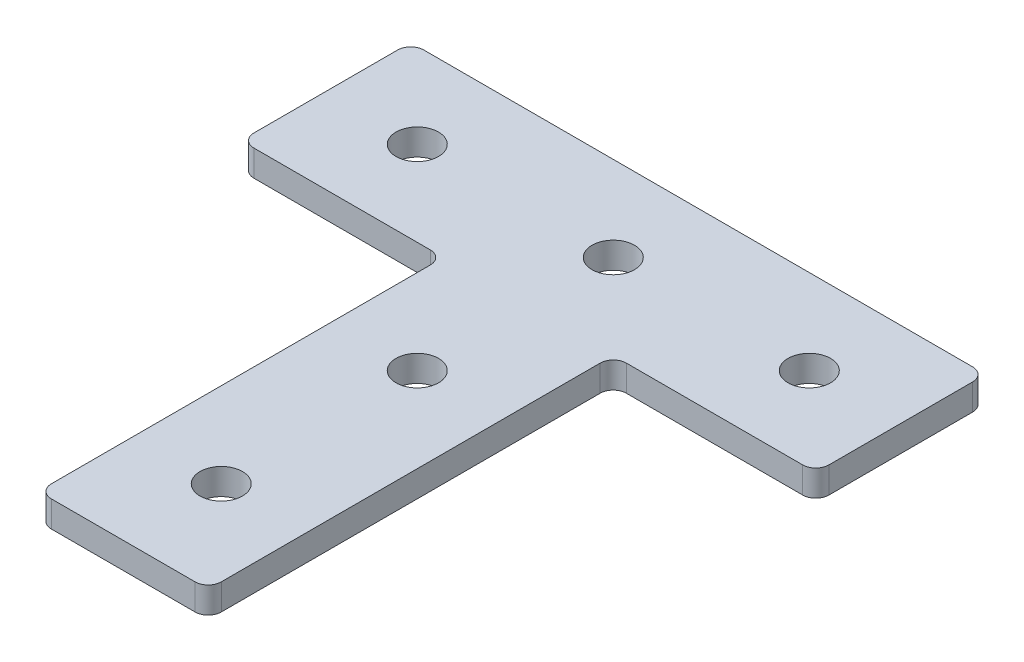
ISO-10303-21;
HEADER;
FILE_DESCRIPTION(('STEP AP214'),'2;1');
FILE_NAME('part.step','',(''),(''),'','','');
FILE_SCHEMA(('AUTOMOTIVE_DESIGN { 1 0 10303 214 1 1 1 1 }'));
ENDSEC;
DATA;
#1=APPLICATION_CONTEXT('core data for automotive mechanical design processes');
#2=APPLICATION_PROTOCOL_DEFINITION('international standard','automotive_design',2000,#1);
#3=PRODUCT_CONTEXT('',#1,'mechanical');
#4=PRODUCT('Part','Part','',(#3));
#5=PRODUCT_RELATED_PRODUCT_CATEGORY('part','',(#4));
#6=PRODUCT_DEFINITION_FORMATION('','',#4);
#7=PRODUCT_DEFINITION_CONTEXT('part definition',#1,'design');
#8=PRODUCT_DEFINITION('design','',#6,#7);
#9=PRODUCT_DEFINITION_SHAPE('','',#8);
#10=(LENGTH_UNIT() NAMED_UNIT(*) SI_UNIT(.MILLI.,.METRE.));
#11=(NAMED_UNIT(*) PLANE_ANGLE_UNIT() SI_UNIT($,.RADIAN.));
#12=(NAMED_UNIT(*) SI_UNIT($,.STERADIAN.) SOLID_ANGLE_UNIT());
#13=UNCERTAINTY_MEASURE_WITH_UNIT(LENGTH_MEASURE(1.E-05),#10,'distance_accuracy_value','');
#14=(GEOMETRIC_REPRESENTATION_CONTEXT(3) GLOBAL_UNCERTAINTY_ASSIGNED_CONTEXT((#13)) GLOBAL_UNIT_ASSIGNED_CONTEXT((#10,
#11,#12)) REPRESENTATION_CONTEXT('',''));
#15=CARTESIAN_POINT('',(0.,0.,0.));
#16=DIRECTION('',(0.,0.,1.));
#17=DIRECTION('',(1.,0.,0.));
#18=AXIS2_PLACEMENT_3D('',#15,#16,#17);
#19=CARTESIAN_POINT('',(44.,4.,13.));
#20=DIRECTION('',(-1.,0.,0.));
#21=DIRECTION('',(0.,0.,-1.));
#22=AXIS2_PLACEMENT_3D('',#19,#20,#21);
#23=PLANE('',#22);
#24=DIRECTION('',(0.,0.,1.));
#25=VECTOR('',#24,1.);
#26=CARTESIAN_POINT('',(44.,4.,13.));
#27=LINE('',#26,#25);
#28=CARTESIAN_POINT('',(44.,4.,-11.));
#29=VERTEX_POINT('',#28);
#30=CARTESIAN_POINT('',(44.,4.,11.));
#31=VERTEX_POINT('',#30);
#32=EDGE_CURVE('E180',#29,#31,#27,.T.);
#33=ORIENTED_EDGE('',*,*,#32,.T.);
#34=DIRECTION('',(0.,-1.,0.));
#35=VECTOR('',#34,1.);
#36=CARTESIAN_POINT('',(44.,4.,11.));
#37=LINE('',#36,#35);
#38=CARTESIAN_POINT('',(44.,0.,11.));
#39=VERTEX_POINT('',#38);
#40=EDGE_CURVE('E222',#39,#31,#37,.F.);
#41=ORIENTED_EDGE('',*,*,#40,.F.);
#42=DIRECTION('',(0.,0.,1.));
#43=VECTOR('',#42,1.);
#44=CARTESIAN_POINT('',(44.,0.,13.));
#45=LINE('',#44,#43);
#46=CARTESIAN_POINT('',(44.,0.,-11.));
#47=VERTEX_POINT('',#46);
#48=EDGE_CURVE('E262',#47,#39,#45,.T.);
#49=ORIENTED_EDGE('',*,*,#48,.F.);
#50=DIRECTION('',(0.,-1.,0.));
#51=VECTOR('',#50,1.);
#52=CARTESIAN_POINT('',(44.,4.,-11.));
#53=LINE('',#52,#51);
#54=EDGE_CURVE('E225',#29,#47,#53,.T.);
#55=ORIENTED_EDGE('',*,*,#54,.F.);
#56=EDGE_LOOP('',(#33,#41,#49,#55));
#57=FACE_BOUND('',#56,.T.);
#58=ADVANCED_FACE('F41',(#57),#23,.F.);
#59=CARTESIAN_POINT('',(44.,4.,13.));
#60=DIRECTION('',(0.,0.,-1.));
#61=DIRECTION('',(1.,0.,0.));
#62=AXIS2_PLACEMENT_3D('',#59,#60,#61);
#63=PLANE('',#62);
#64=DIRECTION('',(-1.,0.,0.));
#65=VECTOR('',#64,1.);
#66=CARTESIAN_POINT('',(44.,4.,13.));
#67=LINE('',#66,#65);
#68=CARTESIAN_POINT('',(42.,4.,13.));
#69=VERTEX_POINT('',#68);
#70=CARTESIAN_POINT('',(15.,4.,13.));
#71=VERTEX_POINT('',#70);
#72=EDGE_CURVE('E183',#69,#71,#67,.T.);
#73=ORIENTED_EDGE('',*,*,#72,.T.);
#74=DIRECTION('',(0.,-1.,0.));
#75=VECTOR('',#74,1.);
#76=CARTESIAN_POINT('',(15.,4.,13.));
#77=LINE('',#76,#75);
#78=CARTESIAN_POINT('',(15.,0.,13.));
#79=VERTEX_POINT('',#78);
#80=EDGE_CURVE('E228',#79,#71,#77,.F.);
#81=ORIENTED_EDGE('',*,*,#80,.F.);
#82=DIRECTION('',(-1.,0.,0.));
#83=VECTOR('',#82,1.);
#84=CARTESIAN_POINT('',(44.,0.,13.));
#85=LINE('',#84,#83);
#86=CARTESIAN_POINT('',(42.,0.,13.));
#87=VERTEX_POINT('',#86);
#88=EDGE_CURVE('E257',#87,#79,#85,.T.);
#89=ORIENTED_EDGE('',*,*,#88,.F.);
#90=DIRECTION('',(0.,-1.,0.));
#91=VECTOR('',#90,1.);
#92=CARTESIAN_POINT('',(42.,4.,13.));
#93=LINE('',#92,#91);
#94=EDGE_CURVE('E231',#69,#87,#93,.T.);
#95=ORIENTED_EDGE('',*,*,#94,.F.);
#96=EDGE_LOOP('',(#73,#81,#89,#95));
#97=FACE_BOUND('',#96,.T.);
#98=ADVANCED_FACE('F264',(#97),#63,.F.);
#99=CARTESIAN_POINT('',(13.,4.,13.));
#100=DIRECTION('',(-1.,0.,0.));
#101=DIRECTION('',(0.,0.,-1.));
#102=AXIS2_PLACEMENT_3D('',#99,#100,#101);
#103=PLANE('',#102);
#104=DIRECTION('',(0.,0.,1.));
#105=VECTOR('',#104,1.);
#106=CARTESIAN_POINT('',(13.,4.,13.));
#107=LINE('',#106,#105);
#108=CARTESIAN_POINT('',(13.,4.,15.));
#109=VERTEX_POINT('',#108);
#110=CARTESIAN_POINT('',(13.,4.,73.));
#111=VERTEX_POINT('',#110);
#112=EDGE_CURVE('E266',#109,#111,#107,.T.);
#113=ORIENTED_EDGE('',*,*,#112,.T.);
#114=DIRECTION('',(0.,-1.,0.));
#115=VECTOR('',#114,1.);
#116=CARTESIAN_POINT('',(13.,4.,73.));
#117=LINE('',#116,#115);
#118=CARTESIAN_POINT('',(13.,0.,73.));
#119=VERTEX_POINT('',#118);
#120=EDGE_CURVE('E234',#119,#111,#117,.F.);
#121=ORIENTED_EDGE('',*,*,#120,.F.);
#122=DIRECTION('',(0.,0.,1.));
#123=VECTOR('',#122,1.);
#124=CARTESIAN_POINT('',(13.,0.,13.));
#125=LINE('',#124,#123);
#126=CARTESIAN_POINT('',(13.,0.,15.));
#127=VERTEX_POINT('',#126);
#128=EDGE_CURVE('E261',#127,#119,#125,.T.);
#129=ORIENTED_EDGE('',*,*,#128,.F.);
#130=DIRECTION('',(0.,-1.,0.));
#131=VECTOR('',#130,1.);
#132=CARTESIAN_POINT('',(13.,0.,15.));
#133=LINE('',#132,#131);
#134=EDGE_CURVE('E237',#109,#127,#133,.T.);
#135=ORIENTED_EDGE('',*,*,#134,.F.);
#136=EDGE_LOOP('',(#113,#121,#129,#135));
#137=FACE_BOUND('',#136,.T.);
#138=ADVANCED_FACE('F329',(#137),#103,.F.);
#139=CARTESIAN_POINT('',(-13.,4.,75.));
#140=DIRECTION('',(0.,0.,-1.));
#141=DIRECTION('',(1.,0.,0.));
#142=AXIS2_PLACEMENT_3D('',#139,#140,#141);
#143=PLANE('',#142);
#144=DIRECTION('',(-1.,0.,0.));
#145=VECTOR('',#144,1.);
#146=CARTESIAN_POINT('',(-13.,4.,75.));
#147=LINE('',#146,#145);
#148=CARTESIAN_POINT('',(11.,4.,75.));
#149=VERTEX_POINT('',#148);
#150=CARTESIAN_POINT('',(-11.,4.,75.));
#151=VERTEX_POINT('',#150);
#152=EDGE_CURVE('E269',#149,#151,#147,.T.);
#153=ORIENTED_EDGE('',*,*,#152,.T.);
#154=DIRECTION('',(0.,-1.,0.));
#155=VECTOR('',#154,1.);
#156=CARTESIAN_POINT('',(-11.,4.,75.));
#157=LINE('',#156,#155);
#158=CARTESIAN_POINT('',(-11.,0.,75.));
#159=VERTEX_POINT('',#158);
#160=EDGE_CURVE('E240',#159,#151,#157,.F.);
#161=ORIENTED_EDGE('',*,*,#160,.F.);
#162=DIRECTION('',(-1.,0.,0.));
#163=VECTOR('',#162,1.);
#164=CARTESIAN_POINT('',(-13.,0.,75.));
#165=LINE('',#164,#163);
#166=CARTESIAN_POINT('',(11.,0.,75.));
#167=VERTEX_POINT('',#166);
#168=EDGE_CURVE('E288',#167,#159,#165,.T.);
#169=ORIENTED_EDGE('',*,*,#168,.F.);
#170=DIRECTION('',(0.,-1.,0.));
#171=VECTOR('',#170,1.);
#172=CARTESIAN_POINT('',(11.,4.,75.));
#173=LINE('',#172,#171);
#174=EDGE_CURVE('E243',#149,#167,#173,.T.);
#175=ORIENTED_EDGE('',*,*,#174,.F.);
#176=EDGE_LOOP('',(#153,#161,#169,#175));
#177=FACE_BOUND('',#176,.T.);
#178=ADVANCED_FACE('F384',(#177),#143,.F.);
#179=CARTESIAN_POINT('',(-13.,4.,13.));
#180=DIRECTION('',(1.,0.,0.));
#181=DIRECTION('',(0.,0.,1.));
#182=AXIS2_PLACEMENT_3D('',#179,#180,#181);
#183=PLANE('',#182);
#184=DIRECTION('',(0.,0.,-1.));
#185=VECTOR('',#184,1.);
#186=CARTESIAN_POINT('',(-13.,0.,13.));
#187=LINE('',#186,#185);
#188=CARTESIAN_POINT('',(-13.,0.,73.));
#189=VERTEX_POINT('',#188);
#190=CARTESIAN_POINT('',(-13.,0.,15.));
#191=VERTEX_POINT('',#190);
#192=EDGE_CURVE('E291',#189,#191,#187,.T.);
#193=ORIENTED_EDGE('',*,*,#192,.F.);
#194=DIRECTION('',(0.,-1.,0.));
#195=VECTOR('',#194,1.);
#196=CARTESIAN_POINT('',(-13.,4.,73.));
#197=LINE('',#196,#195);
#198=CARTESIAN_POINT('',(-13.,4.,73.));
#199=VERTEX_POINT('',#198);
#200=EDGE_CURVE('E217',#199,#189,#197,.T.);
#201=ORIENTED_EDGE('',*,*,#200,.F.);
#202=DIRECTION('',(0.,0.,-1.));
#203=VECTOR('',#202,1.);
#204=CARTESIAN_POINT('',(-13.,4.,13.));
#205=LINE('',#204,#203);
#206=CARTESIAN_POINT('',(-13.,4.,15.));
#207=VERTEX_POINT('',#206);
#208=EDGE_CURVE('E275',#199,#207,#205,.T.);
#209=ORIENTED_EDGE('',*,*,#208,.T.);
#210=DIRECTION('',(0.,-1.,0.));
#211=VECTOR('',#210,1.);
#212=CARTESIAN_POINT('',(-13.,4.,15.));
#213=LINE('',#212,#211);
#214=EDGE_CURVE('E220',#191,#207,#213,.F.);
#215=ORIENTED_EDGE('',*,*,#214,.F.);
#216=EDGE_LOOP('',(#193,#201,#209,#215));
#217=FACE_BOUND('',#216,.T.);
#218=ADVANCED_FACE('F379',(#217),#183,.F.);
#219=CARTESIAN_POINT('',(-44.,4.,13.));
#220=DIRECTION('',(0.,0.,-1.));
#221=DIRECTION('',(1.,0.,0.));
#222=AXIS2_PLACEMENT_3D('',#219,#220,#221);
#223=PLANE('',#222);
#224=DIRECTION('',(-1.,0.,0.));
#225=VECTOR('',#224,1.);
#226=CARTESIAN_POINT('',(-44.,0.,13.));
#227=LINE('',#226,#225);
#228=CARTESIAN_POINT('',(-15.,0.,13.));
#229=VERTEX_POINT('',#228);
#230=CARTESIAN_POINT('',(-42.,0.,13.));
#231=VERTEX_POINT('',#230);
#232=EDGE_CURVE('E185',#229,#231,#227,.T.);
#233=ORIENTED_EDGE('',*,*,#232,.F.);
#234=DIRECTION('',(0.,-1.,0.));
#235=VECTOR('',#234,1.);
#236=CARTESIAN_POINT('',(-15.,0.,13.));
#237=LINE('',#236,#235);
#238=CARTESIAN_POINT('',(-15.,4.,13.));
#239=VERTEX_POINT('',#238);
#240=EDGE_CURVE('E213',#239,#229,#237,.T.);
#241=ORIENTED_EDGE('',*,*,#240,.F.);
#242=DIRECTION('',(-1.,0.,0.));
#243=VECTOR('',#242,1.);
#244=CARTESIAN_POINT('',(-44.,4.,13.));
#245=LINE('',#244,#243);
#246=CARTESIAN_POINT('',(-42.,4.,13.));
#247=VERTEX_POINT('',#246);
#248=EDGE_CURVE('E278',#239,#247,#245,.T.);
#249=ORIENTED_EDGE('',*,*,#248,.T.);
#250=DIRECTION('',(0.,-1.,0.));
#251=VECTOR('',#250,1.);
#252=CARTESIAN_POINT('',(-42.,4.,13.));
#253=LINE('',#252,#251);
#254=EDGE_CURVE('E215',#231,#247,#253,.F.);
#255=ORIENTED_EDGE('',*,*,#254,.F.);
#256=EDGE_LOOP('',(#233,#241,#249,#255));
#257=FACE_BOUND('',#256,.T.);
#258=ADVANCED_FACE('F298',(#257),#223,.F.);
#259=CARTESIAN_POINT('',(-44.,4.,13.));
#260=DIRECTION('',(1.,0.,0.));
#261=DIRECTION('',(0.,0.,1.));
#262=AXIS2_PLACEMENT_3D('',#259,#260,#261);
#263=PLANE('',#262);
#264=DIRECTION('',(0.,0.,-1.));
#265=VECTOR('',#264,1.);
#266=CARTESIAN_POINT('',(-44.,0.,13.));
#267=LINE('',#266,#265);
#268=CARTESIAN_POINT('',(-44.,0.,11.));
#269=VERTEX_POINT('',#268);
#270=CARTESIAN_POINT('',(-44.,0.,-11.));
#271=VERTEX_POINT('',#270);
#272=EDGE_CURVE('E161',#269,#271,#267,.T.);
#273=ORIENTED_EDGE('',*,*,#272,.F.);
#274=DIRECTION('',(0.,-1.,0.));
#275=VECTOR('',#274,1.);
#276=CARTESIAN_POINT('',(-44.,4.,11.));
#277=LINE('',#276,#275);
#278=CARTESIAN_POINT('',(-44.,4.,11.));
#279=VERTEX_POINT('',#278);
#280=EDGE_CURVE('E165',#279,#269,#277,.T.);
#281=ORIENTED_EDGE('',*,*,#280,.F.);
#282=DIRECTION('',(0.,0.,-1.));
#283=VECTOR('',#282,1.);
#284=CARTESIAN_POINT('',(-44.,4.,13.));
#285=LINE('',#284,#283);
#286=CARTESIAN_POINT('',(-44.,4.,-11.));
#287=VERTEX_POINT('',#286);
#288=EDGE_CURVE('E281',#279,#287,#285,.T.);
#289=ORIENTED_EDGE('',*,*,#288,.T.);
#290=DIRECTION('',(0.,-1.,0.));
#291=VECTOR('',#290,1.);
#292=CARTESIAN_POINT('',(-44.,4.,-11.));
#293=LINE('',#292,#291);
#294=EDGE_CURVE('E201',#271,#287,#293,.F.);
#295=ORIENTED_EDGE('',*,*,#294,.F.);
#296=EDGE_LOOP('',(#273,#281,#289,#295));
#297=FACE_BOUND('',#296,.T.);
#298=ADVANCED_FACE('F303',(#297),#263,.F.);
#299=CARTESIAN_POINT('',(-44.,4.,-13.));
#300=DIRECTION('',(0.,0.,1.));
#301=DIRECTION('',(-1.,0.,0.));
#302=AXIS2_PLACEMENT_3D('',#299,#300,#301);
#303=PLANE('',#302);
#304=DIRECTION('',(1.,0.,0.));
#305=VECTOR('',#304,1.);
#306=CARTESIAN_POINT('',(-44.,4.,-13.));
#307=LINE('',#306,#305);
#308=CARTESIAN_POINT('',(-42.,4.,-13.));
#309=VERTEX_POINT('',#308);
#310=CARTESIAN_POINT('',(42.,4.,-13.));
#311=VERTEX_POINT('',#310);
#312=EDGE_CURVE('E189',#309,#311,#307,.T.);
#313=ORIENTED_EDGE('',*,*,#312,.T.);
#314=DIRECTION('',(0.,-1.,0.));
#315=VECTOR('',#314,1.);
#316=CARTESIAN_POINT('',(42.,4.,-13.));
#317=LINE('',#316,#315);
#318=CARTESIAN_POINT('',(42.,0.,-13.));
#319=VERTEX_POINT('',#318);
#320=EDGE_CURVE('E176',#319,#311,#317,.F.);
#321=ORIENTED_EDGE('',*,*,#320,.F.);
#322=DIRECTION('',(1.,0.,0.));
#323=VECTOR('',#322,1.);
#324=CARTESIAN_POINT('',(-44.,0.,-13.));
#325=LINE('',#324,#323);
#326=CARTESIAN_POINT('',(-42.,0.,-13.));
#327=VERTEX_POINT('',#326);
#328=EDGE_CURVE('E158',#327,#319,#325,.T.);
#329=ORIENTED_EDGE('',*,*,#328,.F.);
#330=DIRECTION('',(0.,-1.,0.));
#331=VECTOR('',#330,1.);
#332=CARTESIAN_POINT('',(-42.,4.,-13.));
#333=LINE('',#332,#331);
#334=EDGE_CURVE('E169',#309,#327,#333,.T.);
#335=ORIENTED_EDGE('',*,*,#334,.F.);
#336=EDGE_LOOP('',(#313,#321,#329,#335));
#337=FACE_BOUND('',#336,.T.);
#338=ADVANCED_FACE('F178',(#337),#303,.F.);
#339=CARTESIAN_POINT('',(0.,4.,0.));
#340=DIRECTION('',(0.,1.,0.));
#341=DIRECTION('',(0.,0.,-1.));
#342=AXIS2_PLACEMENT_3D('',#339,#340,#341);
#343=PLANE('',#342);
#344=CARTESIAN_POINT('',(3.12396350297161E-13,4.,30.));
#345=DIRECTION('',(0.,-1.,0.));
#346=DIRECTION('',(0.,0.,-1.));
#347=AXIS2_PLACEMENT_3D('',#344,#345,#346);
#348=CIRCLE('',#347,3.25);
#349=CARTESIAN_POINT('',(3.12396350297161E-13,4.,26.75));
#350=VERTEX_POINT('',#349);
#351=EDGE_CURVE('E524',#350,#350,#348,.T.);
#352=ORIENTED_EDGE('',*,*,#351,.T.);
#353=EDGE_LOOP('',(#352));
#354=FACE_BOUND('',#353,.T.);
#355=CARTESIAN_POINT('',(0.,4.,60.));
#356=DIRECTION('',(0.,-1.,0.));
#357=DIRECTION('',(0.,0.,-1.));
#358=AXIS2_PLACEMENT_3D('',#355,#356,#357);
#359=CIRCLE('',#358,3.25);
#360=CARTESIAN_POINT('',(0.,4.,56.75));
#361=VERTEX_POINT('',#360);
#362=EDGE_CURVE('E528',#361,#361,#359,.T.);
#363=ORIENTED_EDGE('',*,*,#362,.T.);
#364=EDGE_LOOP('',(#363));
#365=FACE_BOUND('',#364,.T.);
#366=CARTESIAN_POINT('',(-30.,4.,-2.09488880330588E-13));
#367=DIRECTION('',(0.,-1.,0.));
#368=DIRECTION('',(0.,0.,-1.));
#369=AXIS2_PLACEMENT_3D('',#366,#367,#368);
#370=CIRCLE('',#369,3.25);
#371=CARTESIAN_POINT('',(-30.,4.,-3.25000000000021));
#372=VERTEX_POINT('',#371);
#373=EDGE_CURVE('E545',#372,#372,#370,.T.);
#374=ORIENTED_EDGE('',*,*,#373,.T.);
#375=EDGE_LOOP('',(#374));
#376=FACE_BOUND('',#375,.T.);
#377=CARTESIAN_POINT('',(30.,4.,0.));
#378=DIRECTION('',(0.,-1.,0.));
#379=DIRECTION('',(0.,0.,-1.));
#380=AXIS2_PLACEMENT_3D('',#377,#378,#379);
#381=CIRCLE('',#380,3.25);
#382=CARTESIAN_POINT('',(30.,4.,-3.25));
#383=VERTEX_POINT('',#382);
#384=EDGE_CURVE('E536',#383,#383,#381,.T.);
#385=ORIENTED_EDGE('',*,*,#384,.T.);
#386=EDGE_LOOP('',(#385));
#387=FACE_BOUND('',#386,.T.);
#388=CARTESIAN_POINT('',(0.,4.,0.));
#389=DIRECTION('',(0.,-1.,0.));
#390=DIRECTION('',(0.,0.,-1.));
#391=AXIS2_PLACEMENT_3D('',#388,#389,#390);
#392=CIRCLE('',#391,3.25);
#393=CARTESIAN_POINT('',(0.,4.,-3.25));
#394=VERTEX_POINT('',#393);
#395=EDGE_CURVE('E534',#394,#394,#392,.T.);
#396=ORIENTED_EDGE('',*,*,#395,.T.);
#397=EDGE_LOOP('',(#396));
#398=FACE_BOUND('',#397,.T.);
#399=ORIENTED_EDGE('',*,*,#288,.F.);
#400=CARTESIAN_POINT('',(-42.,4.,11.));
#401=DIRECTION('',(0.,-1.,0.));
#402=DIRECTION('',(0.,0.,-1.));
#403=AXIS2_PLACEMENT_3D('',#400,#401,#402);
#404=CIRCLE('',#403,2.);
#405=EDGE_CURVE('E56',#247,#279,#404,.T.);
#406=ORIENTED_EDGE('',*,*,#405,.F.);
#407=ORIENTED_EDGE('',*,*,#248,.F.);
#408=CARTESIAN_POINT('',(-15.,4.,15.));
#409=DIRECTION('',(0.,-1.,0.));
#410=DIRECTION('',(0.,0.,-1.));
#411=AXIS2_PLACEMENT_3D('',#408,#409,#410);
#412=CIRCLE('',#411,2.);
#413=EDGE_CURVE('E64',#207,#239,#412,.F.);
#414=ORIENTED_EDGE('',*,*,#413,.F.);
#415=ORIENTED_EDGE('',*,*,#208,.F.);
#416=CARTESIAN_POINT('',(-11.,4.,73.));
#417=DIRECTION('',(0.,-1.,0.));
#418=DIRECTION('',(0.,0.,-1.));
#419=AXIS2_PLACEMENT_3D('',#416,#417,#418);
#420=CIRCLE('',#419,2.);
#421=EDGE_CURVE('E203',#151,#199,#420,.T.);
#422=ORIENTED_EDGE('',*,*,#421,.F.);
#423=ORIENTED_EDGE('',*,*,#152,.F.);
#424=CARTESIAN_POINT('',(11.,4.,73.));
#425=DIRECTION('',(0.,-1.,0.));
#426=DIRECTION('',(0.,0.,-1.));
#427=AXIS2_PLACEMENT_3D('',#424,#425,#426);
#428=CIRCLE('',#427,2.);
#429=EDGE_CURVE('E205',#111,#149,#428,.T.);
#430=ORIENTED_EDGE('',*,*,#429,.F.);
#431=ORIENTED_EDGE('',*,*,#112,.F.);
#432=CARTESIAN_POINT('',(15.,4.,15.));
#433=DIRECTION('',(0.,-1.,0.));
#434=DIRECTION('',(0.,0.,-1.));
#435=AXIS2_PLACEMENT_3D('',#432,#433,#434);
#436=CIRCLE('',#435,2.);
#437=EDGE_CURVE('E11',#71,#109,#436,.F.);
#438=ORIENTED_EDGE('',*,*,#437,.F.);
#439=ORIENTED_EDGE('',*,*,#72,.F.);
#440=CARTESIAN_POINT('',(42.,4.,11.));
#441=DIRECTION('',(0.,-1.,0.));
#442=DIRECTION('',(0.,0.,-1.));
#443=AXIS2_PLACEMENT_3D('',#440,#441,#442);
#444=CIRCLE('',#443,2.);
#445=EDGE_CURVE('E207',#31,#69,#444,.T.);
#446=ORIENTED_EDGE('',*,*,#445,.F.);
#447=ORIENTED_EDGE('',*,*,#32,.F.);
#448=CARTESIAN_POINT('',(42.,4.,-11.));
#449=DIRECTION('',(0.,-1.,0.));
#450=DIRECTION('',(0.,0.,-1.));
#451=AXIS2_PLACEMENT_3D('',#448,#449,#450);
#452=CIRCLE('',#451,2.);
#453=EDGE_CURVE('E209',#311,#29,#452,.T.);
#454=ORIENTED_EDGE('',*,*,#453,.F.);
#455=ORIENTED_EDGE('',*,*,#312,.F.);
#456=CARTESIAN_POINT('',(-42.,4.,-11.));
#457=DIRECTION('',(0.,-1.,0.));
#458=DIRECTION('',(0.,0.,-1.));
#459=AXIS2_PLACEMENT_3D('',#456,#457,#458);
#460=CIRCLE('',#459,2.);
#461=EDGE_CURVE('E171',#287,#309,#460,.T.);
#462=ORIENTED_EDGE('',*,*,#461,.F.);
#463=EDGE_LOOP('',(#399,#406,#407,#414,#415,#422,#423,#430,#431,#438,#439,#446,#447,#454,#455,#462));
#464=FACE_BOUND('',#463,.T.);
#465=ADVANCED_FACE('F304',(#354,#365,#376,#387,#398,#464),#343,.T.);
#466=CARTESIAN_POINT('',(0.,0.,0.));
#467=DIRECTION('',(0.,1.,0.));
#468=DIRECTION('',(0.,0.,-1.));
#469=AXIS2_PLACEMENT_3D('',#466,#467,#468);
#470=PLANE('',#469);
#471=CARTESIAN_POINT('',(3.12396350297161E-13,0.,30.));
#472=DIRECTION('',(0.,-1.,0.));
#473=DIRECTION('',(0.,0.,-1.));
#474=AXIS2_PLACEMENT_3D('',#471,#472,#473);
#475=CIRCLE('',#474,3.25);
#476=CARTESIAN_POINT('',(3.12396350297161E-13,0.,26.75));
#477=VERTEX_POINT('',#476);
#478=EDGE_CURVE('E521',#477,#477,#475,.T.);
#479=ORIENTED_EDGE('',*,*,#478,.F.);
#480=EDGE_LOOP('',(#479));
#481=FACE_BOUND('',#480,.T.);
#482=CARTESIAN_POINT('',(0.,0.,60.));
#483=DIRECTION('',(0.,-1.,0.));
#484=DIRECTION('',(0.,0.,-1.));
#485=AXIS2_PLACEMENT_3D('',#482,#483,#484);
#486=CIRCLE('',#485,3.25);
#487=CARTESIAN_POINT('',(0.,0.,56.75));
#488=VERTEX_POINT('',#487);
#489=EDGE_CURVE('E525',#488,#488,#486,.T.);
#490=ORIENTED_EDGE('',*,*,#489,.F.);
#491=EDGE_LOOP('',(#490));
#492=FACE_BOUND('',#491,.T.);
#493=CARTESIAN_POINT('',(-30.,0.,-2.09488880330588E-13));
#494=DIRECTION('',(0.,-1.,0.));
#495=DIRECTION('',(0.,0.,-1.));
#496=AXIS2_PLACEMENT_3D('',#493,#494,#495);
#497=CIRCLE('',#496,3.25);
#498=CARTESIAN_POINT('',(-30.,0.,-3.25000000000021));
#499=VERTEX_POINT('',#498);
#500=EDGE_CURVE('E550',#499,#499,#497,.T.);
#501=ORIENTED_EDGE('',*,*,#500,.F.);
#502=EDGE_LOOP('',(#501));
#503=FACE_BOUND('',#502,.T.);
#504=CARTESIAN_POINT('',(30.,0.,0.));
#505=DIRECTION('',(0.,-1.,0.));
#506=DIRECTION('',(0.,0.,-1.));
#507=AXIS2_PLACEMENT_3D('',#504,#505,#506);
#508=CIRCLE('',#507,3.25);
#509=CARTESIAN_POINT('',(30.,0.,-3.25));
#510=VERTEX_POINT('',#509);
#511=EDGE_CURVE('E540',#510,#510,#508,.T.);
#512=ORIENTED_EDGE('',*,*,#511,.F.);
#513=EDGE_LOOP('',(#512));
#514=FACE_BOUND('',#513,.T.);
#515=CARTESIAN_POINT('',(0.,0.,0.));
#516=DIRECTION('',(0.,-1.,0.));
#517=DIRECTION('',(0.,0.,-1.));
#518=AXIS2_PLACEMENT_3D('',#515,#516,#517);
#519=CIRCLE('',#518,3.25);
#520=CARTESIAN_POINT('',(0.,0.,-3.25));
#521=VERTEX_POINT('',#520);
#522=EDGE_CURVE('E285',#521,#521,#519,.T.);
#523=ORIENTED_EDGE('',*,*,#522,.F.);
#524=EDGE_LOOP('',(#523));
#525=FACE_BOUND('',#524,.T.);
#526=ORIENTED_EDGE('',*,*,#328,.T.);
#527=CARTESIAN_POINT('',(42.,0.,-11.));
#528=DIRECTION('',(0.,-1.,0.));
#529=DIRECTION('',(0.,0.,-1.));
#530=AXIS2_PLACEMENT_3D('',#527,#528,#529);
#531=CIRCLE('',#530,2.);
#532=EDGE_CURVE('E196',#47,#319,#531,.F.);
#533=ORIENTED_EDGE('',*,*,#532,.F.);
#534=ORIENTED_EDGE('',*,*,#48,.T.);
#535=CARTESIAN_POINT('',(42.,0.,11.));
#536=DIRECTION('',(0.,-1.,0.));
#537=DIRECTION('',(0.,0.,-1.));
#538=AXIS2_PLACEMENT_3D('',#535,#536,#537);
#539=CIRCLE('',#538,2.);
#540=EDGE_CURVE('E194',#87,#39,#539,.F.);
#541=ORIENTED_EDGE('',*,*,#540,.F.);
#542=ORIENTED_EDGE('',*,*,#88,.T.);
#543=CARTESIAN_POINT('',(15.,0.,15.));
#544=DIRECTION('',(0.,-1.,0.));
#545=DIRECTION('',(0.,0.,-1.));
#546=AXIS2_PLACEMENT_3D('',#543,#544,#545);
#547=CIRCLE('',#546,2.);
#548=EDGE_CURVE('E49',#127,#79,#547,.T.);
#549=ORIENTED_EDGE('',*,*,#548,.F.);
#550=ORIENTED_EDGE('',*,*,#128,.T.);
#551=CARTESIAN_POINT('',(11.,0.,73.));
#552=DIRECTION('',(0.,-1.,0.));
#553=DIRECTION('',(0.,0.,-1.));
#554=AXIS2_PLACEMENT_3D('',#551,#552,#553);
#555=CIRCLE('',#554,2.);
#556=EDGE_CURVE('E192',#167,#119,#555,.F.);
#557=ORIENTED_EDGE('',*,*,#556,.F.);
#558=ORIENTED_EDGE('',*,*,#168,.T.);
#559=CARTESIAN_POINT('',(-11.,0.,73.));
#560=DIRECTION('',(0.,-1.,0.));
#561=DIRECTION('',(0.,0.,-1.));
#562=AXIS2_PLACEMENT_3D('',#559,#560,#561);
#563=CIRCLE('',#562,2.);
#564=EDGE_CURVE('E175',#189,#159,#563,.F.);
#565=ORIENTED_EDGE('',*,*,#564,.F.);
#566=ORIENTED_EDGE('',*,*,#192,.T.);
#567=CARTESIAN_POINT('',(-15.,0.,15.));
#568=DIRECTION('',(0.,-1.,0.));
#569=DIRECTION('',(0.,0.,-1.));
#570=AXIS2_PLACEMENT_3D('',#567,#568,#569);
#571=CIRCLE('',#570,2.);
#572=EDGE_CURVE('E246',#229,#191,#571,.T.);
#573=ORIENTED_EDGE('',*,*,#572,.F.);
#574=ORIENTED_EDGE('',*,*,#232,.T.);
#575=CARTESIAN_POINT('',(-42.,0.,11.));
#576=DIRECTION('',(0.,-1.,0.));
#577=DIRECTION('',(0.,0.,-1.));
#578=AXIS2_PLACEMENT_3D('',#575,#576,#577);
#579=CIRCLE('',#578,2.);
#580=EDGE_CURVE('E166',#269,#231,#579,.F.);
#581=ORIENTED_EDGE('',*,*,#580,.F.);
#582=ORIENTED_EDGE('',*,*,#272,.T.);
#583=CARTESIAN_POINT('',(-42.,0.,-11.));
#584=DIRECTION('',(0.,-1.,0.));
#585=DIRECTION('',(0.,0.,-1.));
#586=AXIS2_PLACEMENT_3D('',#583,#584,#585);
#587=CIRCLE('',#586,2.);
#588=EDGE_CURVE('E154',#327,#271,#587,.F.);
#589=ORIENTED_EDGE('',*,*,#588,.F.);
#590=EDGE_LOOP('',(#526,#533,#534,#541,#542,#549,#550,#557,#558,#565,#566,#573,#574,#581,#582,#589));
#591=FACE_BOUND('',#590,.T.);
#592=ADVANCED_FACE('F156',(#481,#492,#503,#514,#525,#591),#470,.F.);
#593=CARTESIAN_POINT('',(0.,0.,0.));
#594=DIRECTION('',(0.,1.,0.));
#595=DIRECTION('',(0.,0.,-1.));
#596=AXIS2_PLACEMENT_3D('',#593,#594,#595);
#597=CYLINDRICAL_SURFACE('',#596,3.25);
#598=ORIENTED_EDGE('',*,*,#522,.T.);
#599=EDGE_LOOP('',(#598));
#600=FACE_BOUND('',#599,.T.);
#601=ORIENTED_EDGE('',*,*,#395,.F.);
#602=EDGE_LOOP('',(#601));
#603=FACE_BOUND('',#602,.T.);
#604=ADVANCED_FACE('F419',(#600,#603),#597,.F.);
#605=CARTESIAN_POINT('',(30.,0.,0.));
#606=DIRECTION('',(0.,1.,0.));
#607=DIRECTION('',(0.,0.,-1.));
#608=AXIS2_PLACEMENT_3D('',#605,#606,#607);
#609=CYLINDRICAL_SURFACE('',#608,3.25);
#610=ORIENTED_EDGE('',*,*,#511,.T.);
#611=EDGE_LOOP('',(#610));
#612=FACE_BOUND('',#611,.T.);
#613=ORIENTED_EDGE('',*,*,#384,.F.);
#614=EDGE_LOOP('',(#613));
#615=FACE_BOUND('',#614,.T.);
#616=ADVANCED_FACE('F428',(#612,#615),#609,.F.);
#617=CARTESIAN_POINT('',(-30.,0.,-2.09488880330588E-13));
#618=DIRECTION('',(0.,1.,0.));
#619=DIRECTION('',(0.,0.,-1.));
#620=AXIS2_PLACEMENT_3D('',#617,#618,#619);
#621=CYLINDRICAL_SURFACE('',#620,3.25);
#622=ORIENTED_EDGE('',*,*,#500,.T.);
#623=EDGE_LOOP('',(#622));
#624=FACE_BOUND('',#623,.T.);
#625=ORIENTED_EDGE('',*,*,#373,.F.);
#626=EDGE_LOOP('',(#625));
#627=FACE_BOUND('',#626,.T.);
#628=ADVANCED_FACE('F437',(#624,#627),#621,.F.);
#629=CARTESIAN_POINT('',(0.,0.,60.));
#630=DIRECTION('',(0.,1.,0.));
#631=DIRECTION('',(0.,0.,-1.));
#632=AXIS2_PLACEMENT_3D('',#629,#630,#631);
#633=CYLINDRICAL_SURFACE('',#632,3.25);
#634=ORIENTED_EDGE('',*,*,#489,.T.);
#635=EDGE_LOOP('',(#634));
#636=FACE_BOUND('',#635,.T.);
#637=ORIENTED_EDGE('',*,*,#362,.F.);
#638=EDGE_LOOP('',(#637));
#639=FACE_BOUND('',#638,.T.);
#640=ADVANCED_FACE('F446',(#636,#639),#633,.F.);
#641=CARTESIAN_POINT('',(3.12396350297161E-13,0.,30.));
#642=DIRECTION('',(0.,1.,0.));
#643=DIRECTION('',(0.,0.,-1.));
#644=AXIS2_PLACEMENT_3D('',#641,#642,#643);
#645=CYLINDRICAL_SURFACE('',#644,3.25);
#646=ORIENTED_EDGE('',*,*,#478,.T.);
#647=EDGE_LOOP('',(#646));
#648=FACE_BOUND('',#647,.T.);
#649=ORIENTED_EDGE('',*,*,#351,.F.);
#650=EDGE_LOOP('',(#649));
#651=FACE_BOUND('',#650,.T.);
#652=ADVANCED_FACE('F335',(#648,#651),#645,.F.);
#653=CARTESIAN_POINT('',(-42.,4.,-11.));
#654=DIRECTION('',(0.,-1.,0.));
#655=DIRECTION('',(0.,0.,1.));
#656=AXIS2_PLACEMENT_3D('',#653,#654,#655);
#657=CYLINDRICAL_SURFACE('',#656,2.);
#658=ORIENTED_EDGE('',*,*,#461,.T.);
#659=ORIENTED_EDGE('',*,*,#334,.T.);
#660=ORIENTED_EDGE('',*,*,#588,.T.);
#661=ORIENTED_EDGE('',*,*,#294,.T.);
#662=EDGE_LOOP('',(#658,#659,#660,#661));
#663=FACE_BOUND('',#662,.T.);
#664=ADVANCED_FACE('F170',(#663),#657,.T.);
#665=CARTESIAN_POINT('',(-42.,4.,11.));
#666=DIRECTION('',(0.,-1.,0.));
#667=DIRECTION('',(0.,0.,1.));
#668=AXIS2_PLACEMENT_3D('',#665,#666,#667);
#669=CYLINDRICAL_SURFACE('',#668,2.);
#670=ORIENTED_EDGE('',*,*,#405,.T.);
#671=ORIENTED_EDGE('',*,*,#280,.T.);
#672=ORIENTED_EDGE('',*,*,#580,.T.);
#673=ORIENTED_EDGE('',*,*,#254,.T.);
#674=EDGE_LOOP('',(#670,#671,#672,#673));
#675=FACE_BOUND('',#674,.T.);
#676=ADVANCED_FACE('F300',(#675),#669,.T.);
#677=CARTESIAN_POINT('',(-15.,4.,15.));
#678=DIRECTION('',(0.,1.,0.));
#679=DIRECTION('',(0.,0.,-1.));
#680=AXIS2_PLACEMENT_3D('',#677,#678,#679);
#681=CYLINDRICAL_SURFACE('',#680,2.);
#682=ORIENTED_EDGE('',*,*,#413,.T.);
#683=ORIENTED_EDGE('',*,*,#240,.T.);
#684=ORIENTED_EDGE('',*,*,#572,.T.);
#685=ORIENTED_EDGE('',*,*,#214,.T.);
#686=EDGE_LOOP('',(#682,#683,#684,#685));
#687=FACE_BOUND('',#686,.T.);
#688=ADVANCED_FACE('F322',(#687),#681,.F.);
#689=CARTESIAN_POINT('',(42.,4.,-11.));
#690=DIRECTION('',(0.,-1.,0.));
#691=DIRECTION('',(0.,0.,1.));
#692=AXIS2_PLACEMENT_3D('',#689,#690,#691);
#693=CYLINDRICAL_SURFACE('',#692,2.);
#694=ORIENTED_EDGE('',*,*,#453,.T.);
#695=ORIENTED_EDGE('',*,*,#54,.T.);
#696=ORIENTED_EDGE('',*,*,#532,.T.);
#697=ORIENTED_EDGE('',*,*,#320,.T.);
#698=EDGE_LOOP('',(#694,#695,#696,#697));
#699=FACE_BOUND('',#698,.T.);
#700=ADVANCED_FACE('F308',(#699),#693,.T.);
#701=CARTESIAN_POINT('',(42.,4.,11.));
#702=DIRECTION('',(0.,-1.,0.));
#703=DIRECTION('',(0.,0.,1.));
#704=AXIS2_PLACEMENT_3D('',#701,#702,#703);
#705=CYLINDRICAL_SURFACE('',#704,2.);
#706=ORIENTED_EDGE('',*,*,#445,.T.);
#707=ORIENTED_EDGE('',*,*,#94,.T.);
#708=ORIENTED_EDGE('',*,*,#540,.T.);
#709=ORIENTED_EDGE('',*,*,#40,.T.);
#710=EDGE_LOOP('',(#706,#707,#708,#709));
#711=FACE_BOUND('',#710,.T.);
#712=ADVANCED_FACE('F313',(#711),#705,.T.);
#713=CARTESIAN_POINT('',(15.,4.,15.));
#714=DIRECTION('',(0.,1.,0.));
#715=DIRECTION('',(0.,0.,-1.));
#716=AXIS2_PLACEMENT_3D('',#713,#714,#715);
#717=CYLINDRICAL_SURFACE('',#716,2.);
#718=ORIENTED_EDGE('',*,*,#437,.T.);
#719=ORIENTED_EDGE('',*,*,#134,.T.);
#720=ORIENTED_EDGE('',*,*,#548,.T.);
#721=ORIENTED_EDGE('',*,*,#80,.T.);
#722=EDGE_LOOP('',(#718,#719,#720,#721));
#723=FACE_BOUND('',#722,.T.);
#724=ADVANCED_FACE('F250',(#723),#717,.F.);
#725=CARTESIAN_POINT('',(11.,4.,73.));
#726=DIRECTION('',(0.,-1.,0.));
#727=DIRECTION('',(0.,0.,1.));
#728=AXIS2_PLACEMENT_3D('',#725,#726,#727);
#729=CYLINDRICAL_SURFACE('',#728,2.);
#730=ORIENTED_EDGE('',*,*,#429,.T.);
#731=ORIENTED_EDGE('',*,*,#174,.T.);
#732=ORIENTED_EDGE('',*,*,#556,.T.);
#733=ORIENTED_EDGE('',*,*,#120,.T.);
#734=EDGE_LOOP('',(#730,#731,#732,#733));
#735=FACE_BOUND('',#734,.T.);
#736=ADVANCED_FACE('F320',(#735),#729,.T.);
#737=CARTESIAN_POINT('',(-11.,4.,73.));
#738=DIRECTION('',(0.,-1.,0.));
#739=DIRECTION('',(0.,0.,1.));
#740=AXIS2_PLACEMENT_3D('',#737,#738,#739);
#741=CYLINDRICAL_SURFACE('',#740,2.);
#742=ORIENTED_EDGE('',*,*,#421,.T.);
#743=ORIENTED_EDGE('',*,*,#200,.T.);
#744=ORIENTED_EDGE('',*,*,#564,.T.);
#745=ORIENTED_EDGE('',*,*,#160,.T.);
#746=EDGE_LOOP('',(#742,#743,#744,#745));
#747=FACE_BOUND('',#746,.T.);
#748=ADVANCED_FACE('F43',(#747),#741,.T.);
#749=CLOSED_SHELL('',(#58,#98,#138,#178,#218,#258,#298,#338,#465,#592,#604,#616,#628,#640,#652,
#664,#676,#688,#700,#712,#724,#736,#748));
#750=MANIFOLD_SOLID_BREP('B2',#749);
#751=ADVANCED_BREP_SHAPE_REPRESENTATION('',(#18,#750),#14);
#752=SHAPE_DEFINITION_REPRESENTATION(#9,#751);
ENDSEC;
END-ISO-10303-21;
